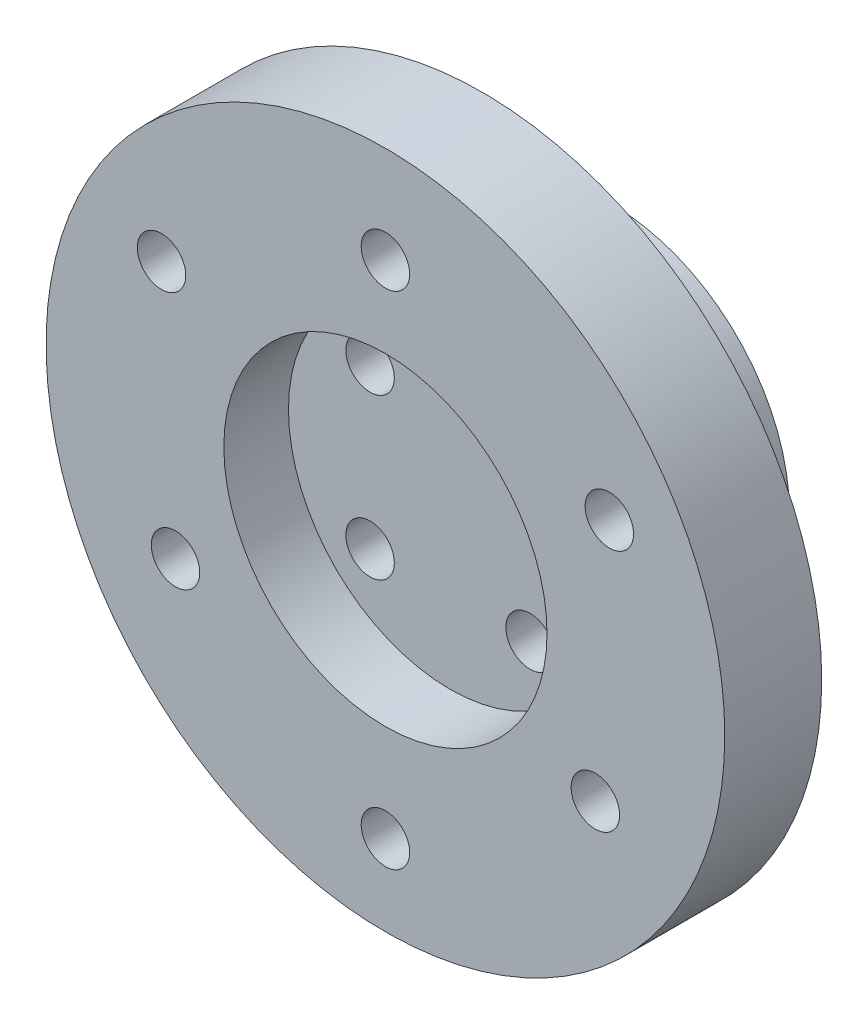
ISO-10303-21;
HEADER;
FILE_DESCRIPTION(('STEP AP214'),'2;1');
FILE_NAME('part.step','',(''),(''),'','','');
FILE_SCHEMA(('AUTOMOTIVE_DESIGN { 1 0 10303 214 1 1 1 1 }'));
ENDSEC;
DATA;
#1=APPLICATION_CONTEXT('core data for automotive mechanical design processes');
#2=APPLICATION_PROTOCOL_DEFINITION('international standard','automotive_design',2000,#1);
#3=PRODUCT_CONTEXT('',#1,'mechanical');
#4=PRODUCT('Part','Part','',(#3));
#5=PRODUCT_RELATED_PRODUCT_CATEGORY('part','',(#4));
#6=PRODUCT_DEFINITION_FORMATION('','',#4);
#7=PRODUCT_DEFINITION_CONTEXT('part definition',#1,'design');
#8=PRODUCT_DEFINITION('design','',#6,#7);
#9=PRODUCT_DEFINITION_SHAPE('','',#8);
#10=(LENGTH_UNIT() NAMED_UNIT(*) SI_UNIT(.MILLI.,.METRE.));
#11=(NAMED_UNIT(*) PLANE_ANGLE_UNIT() SI_UNIT($,.RADIAN.));
#12=(NAMED_UNIT(*) SI_UNIT($,.STERADIAN.) SOLID_ANGLE_UNIT());
#13=UNCERTAINTY_MEASURE_WITH_UNIT(LENGTH_MEASURE(1.E-05),#10,'distance_accuracy_value','');
#14=(GEOMETRIC_REPRESENTATION_CONTEXT(3) GLOBAL_UNCERTAINTY_ASSIGNED_CONTEXT((#13)) GLOBAL_UNIT_ASSIGNED_CONTEXT((#10,
#11,#12)) REPRESENTATION_CONTEXT('',''));
#15=CARTESIAN_POINT('',(0.,0.,0.));
#16=DIRECTION('',(0.,0.,1.));
#17=DIRECTION('',(1.,0.,0.));
#18=AXIS2_PLACEMENT_3D('',#15,#16,#17);
#19=CARTESIAN_POINT('',(-13.856406460551,7.99999999999997,6.));
#20=DIRECTION('',(0.,0.,-1.));
#21=DIRECTION('',(-1.,0.,0.));
#22=AXIS2_PLACEMENT_3D('',#19,#20,#21);
#23=CYLINDRICAL_SURFACE('',#22,1.5);
#24=CARTESIAN_POINT('',(-13.856406460551,7.99999999999997,6.));
#25=DIRECTION('',(0.,0.,-1.));
#26=DIRECTION('',(-1.,0.,0.));
#27=AXIS2_PLACEMENT_3D('',#24,#25,#26);
#28=CIRCLE('',#27,1.5);
#29=CARTESIAN_POINT('',(-15.356406460551,7.99999999999997,6.));
#30=VERTEX_POINT('',#29);
#31=EDGE_CURVE('E106',#30,#30,#28,.T.);
#32=ORIENTED_EDGE('',*,*,#31,.F.);
#33=EDGE_LOOP('',(#32));
#34=FACE_BOUND('',#33,.T.);
#35=CARTESIAN_POINT('',(-13.856406460551,7.99999999999997,2.5));
#36=DIRECTION('',(0.,0.,-1.));
#37=DIRECTION('',(-1.,0.,0.));
#38=AXIS2_PLACEMENT_3D('',#35,#36,#37);
#39=CIRCLE('',#38,1.5);
#40=CARTESIAN_POINT('',(-15.356406460551,7.99999999999997,2.5));
#41=VERTEX_POINT('',#40);
#42=EDGE_CURVE('E39',#41,#41,#39,.F.);
#43=ORIENTED_EDGE('',*,*,#42,.F.);
#44=EDGE_LOOP('',(#43));
#45=FACE_BOUND('',#44,.T.);
#46=ADVANCED_FACE('F35',(#34,#45),#23,.F.);
#47=CARTESIAN_POINT('',(-6.29051784696455E-13,-16.0000000000004,6.));
#48=DIRECTION('',(0.,0.,-1.));
#49=DIRECTION('',(-1.,0.,0.));
#50=AXIS2_PLACEMENT_3D('',#47,#48,#49);
#51=CYLINDRICAL_SURFACE('',#50,1.49999999999979);
#52=CARTESIAN_POINT('',(-6.29051784696455E-13,-16.0000000000004,6.));
#53=DIRECTION('',(0.,0.,-1.));
#54=DIRECTION('',(-1.,0.,0.));
#55=AXIS2_PLACEMENT_3D('',#52,#53,#54);
#56=CIRCLE('',#55,1.49999999999979);
#57=CARTESIAN_POINT('',(-1.50000000000041,-16.0000000000004,6.));
#58=VERTEX_POINT('',#57);
#59=EDGE_CURVE('E109',#58,#58,#56,.T.);
#60=ORIENTED_EDGE('',*,*,#59,.F.);
#61=EDGE_LOOP('',(#60));
#62=FACE_BOUND('',#61,.T.);
#63=CARTESIAN_POINT('',(-6.29051784696455E-13,-16.0000000000004,2.5));
#64=DIRECTION('',(0.,0.,-1.));
#65=DIRECTION('',(-1.,0.,0.));
#66=AXIS2_PLACEMENT_3D('',#63,#64,#65);
#67=CIRCLE('',#66,1.49999999999979);
#68=CARTESIAN_POINT('',(-1.50000000000041,-16.0000000000004,2.5));
#69=VERTEX_POINT('',#68);
#70=EDGE_CURVE('E73',#69,#69,#67,.F.);
#71=ORIENTED_EDGE('',*,*,#70,.F.);
#72=EDGE_LOOP('',(#71));
#73=FACE_BOUND('',#72,.T.);
#74=ADVANCED_FACE('F130',(#62,#73),#51,.F.);
#75=CARTESIAN_POINT('',(13.856406460551,7.99999999999926,6.));
#76=DIRECTION('',(0.,0.,-1.));
#77=DIRECTION('',(-1.,0.,0.));
#78=AXIS2_PLACEMENT_3D('',#75,#76,#77);
#79=CYLINDRICAL_SURFACE('',#78,1.50000000000054);
#80=CARTESIAN_POINT('',(13.856406460551,7.99999999999926,6.));
#81=DIRECTION('',(0.,0.,-1.));
#82=DIRECTION('',(-1.,0.,0.));
#83=AXIS2_PLACEMENT_3D('',#80,#81,#82);
#84=CIRCLE('',#83,1.50000000000054);
#85=CARTESIAN_POINT('',(12.3564064605505,7.99999999999926,6.));
#86=VERTEX_POINT('',#85);
#87=EDGE_CURVE('E99',#86,#86,#84,.T.);
#88=ORIENTED_EDGE('',*,*,#87,.F.);
#89=EDGE_LOOP('',(#88));
#90=FACE_BOUND('',#89,.T.);
#91=CARTESIAN_POINT('',(13.856406460551,7.99999999999926,2.5));
#92=DIRECTION('',(0.,0.,-1.));
#93=DIRECTION('',(-1.,0.,0.));
#94=AXIS2_PLACEMENT_3D('',#91,#92,#93);
#95=CIRCLE('',#94,1.50000000000054);
#96=CARTESIAN_POINT('',(12.3564064605505,7.99999999999926,2.5));
#97=VERTEX_POINT('',#96);
#98=EDGE_CURVE('E71',#97,#97,#95,.F.);
#99=ORIENTED_EDGE('',*,*,#98,.F.);
#100=EDGE_LOOP('',(#99));
#101=FACE_BOUND('',#100,.T.);
#102=ADVANCED_FACE('F133',(#90,#101),#79,.F.);
#103=CARTESIAN_POINT('',(4.94974746830584,4.94974746830582,10.));
#104=DIRECTION('',(0.,0.,-1.));
#105=DIRECTION('',(-1.,0.,0.));
#106=AXIS2_PLACEMENT_3D('',#103,#104,#105);
#107=CYLINDRICAL_SURFACE('',#106,1.5);
#108=CARTESIAN_POINT('',(4.94974746830584,4.94974746830582,-8.));
#109=DIRECTION('',(0.,0.,-1.));
#110=DIRECTION('',(-1.,0.,0.));
#111=AXIS2_PLACEMENT_3D('',#108,#109,#110);
#112=CIRCLE('',#111,1.5);
#113=CARTESIAN_POINT('',(3.44974746830584,4.94974746830582,-8.));
#114=VERTEX_POINT('',#113);
#115=EDGE_CURVE('E52',#114,#114,#112,.T.);
#116=ORIENTED_EDGE('',*,*,#115,.T.);
#117=EDGE_LOOP('',(#116));
#118=FACE_BOUND('',#117,.T.);
#119=CARTESIAN_POINT('',(4.94974746830584,4.94974746830582,2.));
#120=DIRECTION('',(0.,0.,1.));
#121=DIRECTION('',(1.,0.,0.));
#122=AXIS2_PLACEMENT_3D('',#119,#120,#121);
#123=CIRCLE('',#122,1.5);
#124=CARTESIAN_POINT('',(6.44974746830584,4.94974746830582,2.));
#125=VERTEX_POINT('',#124);
#126=EDGE_CURVE('E56',#125,#125,#123,.F.);
#127=ORIENTED_EDGE('',*,*,#126,.F.);
#128=EDGE_LOOP('',(#127));
#129=FACE_BOUND('',#128,.T.);
#130=ADVANCED_FACE('F139',(#118,#129),#107,.F.);
#131=CARTESIAN_POINT('',(-4.94974746830584,4.94974746830582,10.));
#132=DIRECTION('',(0.,0.,-1.));
#133=DIRECTION('',(-1.,0.,0.));
#134=AXIS2_PLACEMENT_3D('',#131,#132,#133);
#135=CYLINDRICAL_SURFACE('',#134,1.5);
#136=CARTESIAN_POINT('',(-4.94974746830584,4.94974746830582,-8.));
#137=DIRECTION('',(0.,0.,-1.));
#138=DIRECTION('',(-1.,0.,0.));
#139=AXIS2_PLACEMENT_3D('',#136,#137,#138);
#140=CIRCLE('',#139,1.5);
#141=CARTESIAN_POINT('',(-6.44974746830584,4.94974746830582,-8.));
#142=VERTEX_POINT('',#141);
#143=EDGE_CURVE('E55',#142,#142,#140,.T.);
#144=ORIENTED_EDGE('',*,*,#143,.T.);
#145=EDGE_LOOP('',(#144));
#146=FACE_BOUND('',#145,.T.);
#147=CARTESIAN_POINT('',(-4.94974746830584,4.94974746830582,2.));
#148=DIRECTION('',(0.,0.,1.));
#149=DIRECTION('',(1.,0.,0.));
#150=AXIS2_PLACEMENT_3D('',#147,#148,#149);
#151=CIRCLE('',#150,1.5);
#152=CARTESIAN_POINT('',(-3.44974746830584,4.94974746830582,2.));
#153=VERTEX_POINT('',#152);
#154=EDGE_CURVE('E92',#153,#153,#151,.F.);
#155=ORIENTED_EDGE('',*,*,#154,.F.);
#156=EDGE_LOOP('',(#155));
#157=FACE_BOUND('',#156,.T.);
#158=ADVANCED_FACE('F194',(#146,#157),#135,.F.);
#159=CARTESIAN_POINT('',(-4.94974746830581,-4.94974746830586,10.));
#160=DIRECTION('',(0.,0.,-1.));
#161=DIRECTION('',(-1.,0.,0.));
#162=AXIS2_PLACEMENT_3D('',#159,#160,#161);
#163=CYLINDRICAL_SURFACE('',#162,1.5);
#164=CARTESIAN_POINT('',(-4.94974746830581,-4.94974746830586,-8.));
#165=DIRECTION('',(0.,0.,-1.));
#166=DIRECTION('',(-1.,0.,0.));
#167=AXIS2_PLACEMENT_3D('',#164,#165,#166);
#168=CIRCLE('',#167,1.5);
#169=CARTESIAN_POINT('',(-6.44974746830581,-4.94974746830586,-8.));
#170=VERTEX_POINT('',#169);
#171=EDGE_CURVE('E59',#170,#170,#168,.T.);
#172=ORIENTED_EDGE('',*,*,#171,.T.);
#173=EDGE_LOOP('',(#172));
#174=FACE_BOUND('',#173,.T.);
#175=CARTESIAN_POINT('',(-4.94974746830581,-4.94974746830586,2.));
#176=DIRECTION('',(0.,0.,1.));
#177=DIRECTION('',(1.,0.,0.));
#178=AXIS2_PLACEMENT_3D('',#175,#176,#177);
#179=CIRCLE('',#178,1.5);
#180=CARTESIAN_POINT('',(-3.44974746830581,-4.94974746830586,2.));
#181=VERTEX_POINT('',#180);
#182=EDGE_CURVE('E69',#181,#181,#179,.F.);
#183=ORIENTED_EDGE('',*,*,#182,.F.);
#184=EDGE_LOOP('',(#183));
#185=FACE_BOUND('',#184,.T.);
#186=ADVANCED_FACE('F186',(#174,#185),#163,.F.);
#187=CARTESIAN_POINT('',(4.94974746830588,-4.94974746830579,10.));
#188=DIRECTION('',(0.,0.,-1.));
#189=DIRECTION('',(-1.,0.,0.));
#190=AXIS2_PLACEMENT_3D('',#187,#188,#189);
#191=CYLINDRICAL_SURFACE('',#190,1.5);
#192=CARTESIAN_POINT('',(4.94974746830588,-4.94974746830579,-8.));
#193=DIRECTION('',(0.,0.,-1.));
#194=DIRECTION('',(-1.,0.,0.));
#195=AXIS2_PLACEMENT_3D('',#192,#193,#194);
#196=CIRCLE('',#195,1.5);
#197=CARTESIAN_POINT('',(3.44974746830588,-4.94974746830579,-8.));
#198=VERTEX_POINT('',#197);
#199=EDGE_CURVE('E62',#198,#198,#196,.T.);
#200=ORIENTED_EDGE('',*,*,#199,.T.);
#201=EDGE_LOOP('',(#200));
#202=FACE_BOUND('',#201,.T.);
#203=CARTESIAN_POINT('',(4.94974746830588,-4.94974746830579,2.));
#204=DIRECTION('',(0.,0.,1.));
#205=DIRECTION('',(1.,0.,0.));
#206=AXIS2_PLACEMENT_3D('',#203,#204,#205);
#207=CIRCLE('',#206,1.5);
#208=CARTESIAN_POINT('',(6.44974746830587,-4.94974746830579,2.));
#209=VERTEX_POINT('',#208);
#210=EDGE_CURVE('E66',#209,#209,#207,.F.);
#211=ORIENTED_EDGE('',*,*,#210,.F.);
#212=EDGE_LOOP('',(#211));
#213=FACE_BOUND('',#212,.T.);
#214=ADVANCED_FACE('F181',(#202,#213),#191,.F.);
#215=CARTESIAN_POINT('',(0.,0.,6.));
#216=DIRECTION('',(0.,0.,-1.));
#217=DIRECTION('',(-1.,0.,0.));
#218=AXIS2_PLACEMENT_3D('',#215,#216,#217);
#219=CYLINDRICAL_SURFACE('',#218,21.);
#220=CARTESIAN_POINT('',(0.,0.,6.));
#221=DIRECTION('',(0.,0.,1.));
#222=DIRECTION('',(1.,0.,0.));
#223=AXIS2_PLACEMENT_3D('',#220,#221,#222);
#224=CIRCLE('',#223,21.);
#225=CARTESIAN_POINT('',(21.,0.,6.));
#226=VERTEX_POINT('',#225);
#227=EDGE_CURVE('E43',#226,#226,#224,.T.);
#228=ORIENTED_EDGE('',*,*,#227,.F.);
#229=EDGE_LOOP('',(#228));
#230=FACE_BOUND('',#229,.T.);
#231=CARTESIAN_POINT('',(0.,0.,0.));
#232=DIRECTION('',(0.,0.,1.));
#233=DIRECTION('',(1.,0.,0.));
#234=AXIS2_PLACEMENT_3D('',#231,#232,#233);
#235=CIRCLE('',#234,21.);
#236=CARTESIAN_POINT('',(21.,0.,0.));
#237=VERTEX_POINT('',#236);
#238=EDGE_CURVE('E48',#237,#237,#235,.T.);
#239=ORIENTED_EDGE('',*,*,#238,.T.);
#240=EDGE_LOOP('',(#239));
#241=FACE_BOUND('',#240,.T.);
#242=ADVANCED_FACE('F37',(#230,#241),#219,.T.);
#243=CARTESIAN_POINT('',(0.,0.,6.));
#244=DIRECTION('',(0.,0.,1.));
#245=DIRECTION('',(1.,0.,0.));
#246=AXIS2_PLACEMENT_3D('',#243,#244,#245);
#247=PLANE('',#246);
#248=CARTESIAN_POINT('',(0.,0.,6.));
#249=DIRECTION('',(0.,0.,1.));
#250=DIRECTION('',(1.,0.,0.));
#251=AXIS2_PLACEMENT_3D('',#248,#249,#250);
#252=CIRCLE('',#251,10.);
#253=CARTESIAN_POINT('',(10.,0.,6.));
#254=VERTEX_POINT('',#253);
#255=EDGE_CURVE('E79',#254,#254,#252,.T.);
#256=ORIENTED_EDGE('',*,*,#255,.F.);
#257=EDGE_LOOP('',(#256));
#258=FACE_BOUND('',#257,.T.);
#259=CARTESIAN_POINT('',(0.,15.,6.));
#260=DIRECTION('',(0.,0.,-1.));
#261=DIRECTION('',(-1.,0.,0.));
#262=AXIS2_PLACEMENT_3D('',#259,#260,#261);
#263=CIRCLE('',#262,1.5);
#264=CARTESIAN_POINT('',(-1.5,15.,6.));
#265=VERTEX_POINT('',#264);
#266=EDGE_CURVE('E100',#265,#265,#263,.T.);
#267=ORIENTED_EDGE('',*,*,#266,.T.);
#268=EDGE_LOOP('',(#267));
#269=FACE_BOUND('',#268,.T.);
#270=ORIENTED_EDGE('',*,*,#87,.T.);
#271=EDGE_LOOP('',(#270));
#272=FACE_BOUND('',#271,.T.);
#273=ORIENTED_EDGE('',*,*,#59,.T.);
#274=EDGE_LOOP('',(#273));
#275=FACE_BOUND('',#274,.T.);
#276=CARTESIAN_POINT('',(12.9903810567656,-7.50000000000055,6.));
#277=DIRECTION('',(0.,0.,-1.));
#278=DIRECTION('',(-1.,0.,0.));
#279=AXIS2_PLACEMENT_3D('',#276,#277,#278);
#280=CIRCLE('',#279,1.5);
#281=CARTESIAN_POINT('',(11.4903810567656,-7.50000000000055,6.));
#282=VERTEX_POINT('',#281);
#283=EDGE_CURVE('E121',#282,#282,#280,.T.);
#284=ORIENTED_EDGE('',*,*,#283,.T.);
#285=EDGE_LOOP('',(#284));
#286=FACE_BOUND('',#285,.T.);
#287=CARTESIAN_POINT('',(-12.9903810567675,-7.49999999999945,6.));
#288=DIRECTION('',(0.,0.,-1.));
#289=DIRECTION('',(-1.,0.,0.));
#290=AXIS2_PLACEMENT_3D('',#287,#288,#289);
#291=CIRCLE('',#290,1.5);
#292=CARTESIAN_POINT('',(-14.4903810567675,-7.49999999999945,6.));
#293=VERTEX_POINT('',#292);
#294=EDGE_CURVE('E115',#293,#293,#291,.T.);
#295=ORIENTED_EDGE('',*,*,#294,.T.);
#296=EDGE_LOOP('',(#295));
#297=FACE_BOUND('',#296,.T.);
#298=ORIENTED_EDGE('',*,*,#31,.T.);
#299=EDGE_LOOP('',(#298));
#300=FACE_BOUND('',#299,.T.);
#301=ORIENTED_EDGE('',*,*,#227,.T.);
#302=EDGE_LOOP('',(#301));
#303=FACE_BOUND('',#302,.T.);
#304=ADVANCED_FACE('F127',(#258,#269,#272,#275,#286,#297,#300,#303),#247,.T.);
#305=CARTESIAN_POINT('',(0.,0.,0.));
#306=DIRECTION('',(0.,0.,1.));
#307=DIRECTION('',(1.,0.,0.));
#308=AXIS2_PLACEMENT_3D('',#305,#306,#307);
#309=PLANE('',#308);
#310=CARTESIAN_POINT('',(13.856406460551,7.99999999999926,0.));
#311=DIRECTION('',(0.,0.,-1.));
#312=DIRECTION('',(-1.,0.,0.));
#313=AXIS2_PLACEMENT_3D('',#310,#311,#312);
#314=CIRCLE('',#313,3.5);
#315=CARTESIAN_POINT('',(10.356406460551,7.99999999999926,0.));
#316=VERTEX_POINT('',#315);
#317=EDGE_CURVE('E161',#316,#316,#314,.T.);
#318=ORIENTED_EDGE('',*,*,#317,.F.);
#319=EDGE_LOOP('',(#318));
#320=FACE_BOUND('',#319,.T.);
#321=CARTESIAN_POINT('',(-13.8564064605504,8.00000000000115,0.));
#322=DIRECTION('',(0.,0.,-1.));
#323=DIRECTION('',(-1.,0.,0.));
#324=AXIS2_PLACEMENT_3D('',#321,#322,#323);
#325=CIRCLE('',#324,3.5);
#326=CARTESIAN_POINT('',(-17.3564064605504,8.00000000000115,0.));
#327=VERTEX_POINT('',#326);
#328=EDGE_CURVE('E165',#327,#327,#325,.T.);
#329=ORIENTED_EDGE('',*,*,#328,.F.);
#330=EDGE_LOOP('',(#329));
#331=FACE_BOUND('',#330,.T.);
#332=CARTESIAN_POINT('',(-1.3165871754241E-12,-15.9999999999992,0.));
#333=DIRECTION('',(0.,0.,-1.));
#334=DIRECTION('',(-1.,0.,0.));
#335=AXIS2_PLACEMENT_3D('',#332,#333,#334);
#336=CIRCLE('',#335,3.5);
#337=CARTESIAN_POINT('',(-3.50000000000132,-15.9999999999992,0.));
#338=VERTEX_POINT('',#337);
#339=EDGE_CURVE('E169',#338,#338,#336,.T.);
#340=ORIENTED_EDGE('',*,*,#339,.F.);
#341=EDGE_LOOP('',(#340));
#342=FACE_BOUND('',#341,.T.);
#343=CARTESIAN_POINT('',(0.,0.,0.));
#344=DIRECTION('',(0.,0.,1.));
#345=DIRECTION('',(1.,0.,0.));
#346=AXIS2_PLACEMENT_3D('',#343,#344,#345);
#347=CIRCLE('',#346,11.);
#348=CARTESIAN_POINT('',(11.,0.,0.));
#349=VERTEX_POINT('',#348);
#350=EDGE_CURVE('E10',#349,#349,#347,.F.);
#351=ORIENTED_EDGE('',*,*,#350,.F.);
#352=EDGE_LOOP('',(#351));
#353=FACE_BOUND('',#352,.T.);
#354=CARTESIAN_POINT('',(0.,15.,0.));
#355=DIRECTION('',(0.,0.,-1.));
#356=DIRECTION('',(-1.,0.,0.));
#357=AXIS2_PLACEMENT_3D('',#354,#355,#356);
#358=CIRCLE('',#357,1.5);
#359=CARTESIAN_POINT('',(-1.5,15.,0.));
#360=VERTEX_POINT('',#359);
#361=EDGE_CURVE('E103',#360,#360,#358,.T.);
#362=ORIENTED_EDGE('',*,*,#361,.F.);
#363=EDGE_LOOP('',(#362));
#364=FACE_BOUND('',#363,.T.);
#365=CARTESIAN_POINT('',(12.9903810567656,-7.50000000000055,0.));
#366=DIRECTION('',(0.,0.,-1.));
#367=DIRECTION('',(-1.,0.,0.));
#368=AXIS2_PLACEMENT_3D('',#365,#366,#367);
#369=CIRCLE('',#368,1.5);
#370=CARTESIAN_POINT('',(11.4903810567656,-7.50000000000055,0.));
#371=VERTEX_POINT('',#370);
#372=EDGE_CURVE('E118',#371,#371,#369,.T.);
#373=ORIENTED_EDGE('',*,*,#372,.F.);
#374=EDGE_LOOP('',(#373));
#375=FACE_BOUND('',#374,.T.);
#376=CARTESIAN_POINT('',(-12.9903810567675,-7.49999999999945,0.));
#377=DIRECTION('',(0.,0.,-1.));
#378=DIRECTION('',(-1.,0.,0.));
#379=AXIS2_PLACEMENT_3D('',#376,#377,#378);
#380=CIRCLE('',#379,1.5);
#381=CARTESIAN_POINT('',(-14.4903810567675,-7.49999999999945,0.));
#382=VERTEX_POINT('',#381);
#383=EDGE_CURVE('E112',#382,#382,#380,.T.);
#384=ORIENTED_EDGE('',*,*,#383,.F.);
#385=EDGE_LOOP('',(#384));
#386=FACE_BOUND('',#385,.T.);
#387=ORIENTED_EDGE('',*,*,#238,.F.);
#388=EDGE_LOOP('',(#387));
#389=FACE_BOUND('',#388,.T.);
#390=ADVANCED_FACE('F149',(#320,#331,#342,#353,#364,#375,#386,#389),#309,.F.);
#391=CARTESIAN_POINT('',(-12.9903810567675,-7.49999999999945,6.));
#392=DIRECTION('',(0.,0.,-1.));
#393=DIRECTION('',(-1.,0.,0.));
#394=AXIS2_PLACEMENT_3D('',#391,#392,#393);
#395=CYLINDRICAL_SURFACE('',#394,1.5);
#396=ORIENTED_EDGE('',*,*,#294,.F.);
#397=EDGE_LOOP('',(#396));
#398=FACE_BOUND('',#397,.T.);
#399=ORIENTED_EDGE('',*,*,#383,.T.);
#400=EDGE_LOOP('',(#399));
#401=FACE_BOUND('',#400,.T.);
#402=ADVANCED_FACE('F152',(#398,#401),#395,.F.);
#403=CARTESIAN_POINT('',(12.9903810567656,-7.50000000000055,6.));
#404=DIRECTION('',(0.,0.,-1.));
#405=DIRECTION('',(-1.,0.,0.));
#406=AXIS2_PLACEMENT_3D('',#403,#404,#405);
#407=CYLINDRICAL_SURFACE('',#406,1.5);
#408=ORIENTED_EDGE('',*,*,#283,.F.);
#409=EDGE_LOOP('',(#408));
#410=FACE_BOUND('',#409,.T.);
#411=ORIENTED_EDGE('',*,*,#372,.T.);
#412=EDGE_LOOP('',(#411));
#413=FACE_BOUND('',#412,.T.);
#414=ADVANCED_FACE('F146',(#410,#413),#407,.F.);
#415=CARTESIAN_POINT('',(0.,15.,6.));
#416=DIRECTION('',(0.,0.,-1.));
#417=DIRECTION('',(-1.,0.,0.));
#418=AXIS2_PLACEMENT_3D('',#415,#416,#417);
#419=CYLINDRICAL_SURFACE('',#418,1.5);
#420=ORIENTED_EDGE('',*,*,#266,.F.);
#421=EDGE_LOOP('',(#420));
#422=FACE_BOUND('',#421,.T.);
#423=ORIENTED_EDGE('',*,*,#361,.T.);
#424=EDGE_LOOP('',(#423));
#425=FACE_BOUND('',#424,.T.);
#426=ADVANCED_FACE('F211',(#422,#425),#419,.F.);
#427=CARTESIAN_POINT('',(0.,0.,-8.));
#428=DIRECTION('',(0.,0.,1.));
#429=DIRECTION('',(1.,0.,0.));
#430=AXIS2_PLACEMENT_3D('',#427,#428,#429);
#431=CYLINDRICAL_SURFACE('',#430,11.);
#432=CARTESIAN_POINT('',(0.,0.,-8.));
#433=DIRECTION('',(0.,0.,-1.));
#434=DIRECTION('',(-1.,0.,0.));
#435=AXIS2_PLACEMENT_3D('',#432,#433,#434);
#436=CIRCLE('',#435,11.);
#437=CARTESIAN_POINT('',(-11.,0.,-8.));
#438=VERTEX_POINT('',#437);
#439=EDGE_CURVE('E65',#438,#438,#436,.T.);
#440=ORIENTED_EDGE('',*,*,#439,.F.);
#441=EDGE_LOOP('',(#440));
#442=FACE_BOUND('',#441,.T.);
#443=ORIENTED_EDGE('',*,*,#350,.T.);
#444=EDGE_LOOP('',(#443));
#445=FACE_BOUND('',#444,.T.);
#446=ADVANCED_FACE('F207',(#442,#445),#431,.T.);
#447=CARTESIAN_POINT('',(0.,0.,-8.));
#448=DIRECTION('',(0.,0.,-1.));
#449=DIRECTION('',(-1.,0.,0.));
#450=AXIS2_PLACEMENT_3D('',#447,#448,#449);
#451=PLANE('',#450);
#452=ORIENTED_EDGE('',*,*,#199,.F.);
#453=EDGE_LOOP('',(#452));
#454=FACE_BOUND('',#453,.T.);
#455=ORIENTED_EDGE('',*,*,#171,.F.);
#456=EDGE_LOOP('',(#455));
#457=FACE_BOUND('',#456,.T.);
#458=ORIENTED_EDGE('',*,*,#143,.F.);
#459=EDGE_LOOP('',(#458));
#460=FACE_BOUND('',#459,.T.);
#461=ORIENTED_EDGE('',*,*,#115,.F.);
#462=EDGE_LOOP('',(#461));
#463=FACE_BOUND('',#462,.T.);
#464=ORIENTED_EDGE('',*,*,#439,.T.);
#465=EDGE_LOOP('',(#464));
#466=FACE_BOUND('',#465,.T.);
#467=ADVANCED_FACE('F203',(#454,#457,#460,#463,#466),#451,.T.);
#468=CARTESIAN_POINT('',(0.,0.,2.));
#469=DIRECTION('',(0.,0.,1.));
#470=DIRECTION('',(1.,0.,0.));
#471=AXIS2_PLACEMENT_3D('',#468,#469,#470);
#472=PLANE('',#471);
#473=CARTESIAN_POINT('',(0.,0.,2.));
#474=DIRECTION('',(0.,0.,1.));
#475=DIRECTION('',(1.,0.,0.));
#476=AXIS2_PLACEMENT_3D('',#473,#474,#475);
#477=CIRCLE('',#476,10.);
#478=CARTESIAN_POINT('',(10.,0.,2.));
#479=VERTEX_POINT('',#478);
#480=EDGE_CURVE('E70',#479,#479,#477,.T.);
#481=ORIENTED_EDGE('',*,*,#480,.T.);
#482=EDGE_LOOP('',(#481));
#483=FACE_BOUND('',#482,.T.);
#484=ORIENTED_EDGE('',*,*,#210,.T.);
#485=EDGE_LOOP('',(#484));
#486=FACE_BOUND('',#485,.T.);
#487=ORIENTED_EDGE('',*,*,#182,.T.);
#488=EDGE_LOOP('',(#487));
#489=FACE_BOUND('',#488,.T.);
#490=ORIENTED_EDGE('',*,*,#154,.T.);
#491=EDGE_LOOP('',(#490));
#492=FACE_BOUND('',#491,.T.);
#493=ORIENTED_EDGE('',*,*,#126,.T.);
#494=EDGE_LOOP('',(#493));
#495=FACE_BOUND('',#494,.T.);
#496=ADVANCED_FACE('F206',(#483,#486,#489,#492,#495),#472,.T.);
#497=CARTESIAN_POINT('',(0.,0.,2.));
#498=DIRECTION('',(0.,0.,1.));
#499=DIRECTION('',(1.,0.,0.));
#500=AXIS2_PLACEMENT_3D('',#497,#498,#499);
#501=CYLINDRICAL_SURFACE('',#500,10.);
#502=ORIENTED_EDGE('',*,*,#480,.F.);
#503=EDGE_LOOP('',(#502));
#504=FACE_BOUND('',#503,.T.);
#505=ORIENTED_EDGE('',*,*,#255,.T.);
#506=EDGE_LOOP('',(#505));
#507=FACE_BOUND('',#506,.T.);
#508=ADVANCED_FACE('F230',(#504,#507),#501,.F.);
#509=CARTESIAN_POINT('',(13.856406460551,7.99999999999926,2.5));
#510=DIRECTION('',(0.,0.,-1.));
#511=DIRECTION('',(-1.,0.,0.));
#512=AXIS2_PLACEMENT_3D('',#509,#510,#511);
#513=PLANE('',#512);
#514=CARTESIAN_POINT('',(13.856406460551,7.99999999999926,2.5));
#515=DIRECTION('',(0.,0.,-1.));
#516=DIRECTION('',(-1.,0.,0.));
#517=AXIS2_PLACEMENT_3D('',#514,#515,#516);
#518=CIRCLE('',#517,3.5);
#519=CARTESIAN_POINT('',(10.356406460551,7.99999999999926,2.5));
#520=VERTEX_POINT('',#519);
#521=EDGE_CURVE('E74',#520,#520,#518,.T.);
#522=ORIENTED_EDGE('',*,*,#521,.T.);
#523=EDGE_LOOP('',(#522));
#524=FACE_BOUND('',#523,.T.);
#525=ORIENTED_EDGE('',*,*,#98,.T.);
#526=EDGE_LOOP('',(#525));
#527=FACE_BOUND('',#526,.T.);
#528=ADVANCED_FACE('F227',(#524,#527),#513,.T.);
#529=CARTESIAN_POINT('',(13.856406460551,7.99999999999926,2.5));
#530=DIRECTION('',(0.,0.,-1.));
#531=DIRECTION('',(-1.,0.,0.));
#532=AXIS2_PLACEMENT_3D('',#529,#530,#531);
#533=CYLINDRICAL_SURFACE('',#532,3.5);
#534=ORIENTED_EDGE('',*,*,#521,.F.);
#535=EDGE_LOOP('',(#534));
#536=FACE_BOUND('',#535,.T.);
#537=ORIENTED_EDGE('',*,*,#317,.T.);
#538=EDGE_LOOP('',(#537));
#539=FACE_BOUND('',#538,.T.);
#540=ADVANCED_FACE('F229',(#536,#539),#533,.F.);
#541=CARTESIAN_POINT('',(-1.3165871754241E-12,-15.9999999999992,2.5));
#542=DIRECTION('',(0.,0.,-1.));
#543=DIRECTION('',(-1.,0.,0.));
#544=AXIS2_PLACEMENT_3D('',#541,#542,#543);
#545=PLANE('',#544);
#546=CARTESIAN_POINT('',(-1.3165871754241E-12,-15.9999999999992,2.5));
#547=DIRECTION('',(0.,0.,-1.));
#548=DIRECTION('',(-1.,0.,0.));
#549=AXIS2_PLACEMENT_3D('',#546,#547,#548);
#550=CIRCLE('',#549,3.5);
#551=CARTESIAN_POINT('',(-3.50000000000132,-15.9999999999992,2.5));
#552=VERTEX_POINT('',#551);
#553=EDGE_CURVE('E455',#552,#552,#550,.T.);
#554=ORIENTED_EDGE('',*,*,#553,.T.);
#555=EDGE_LOOP('',(#554));
#556=FACE_BOUND('',#555,.T.);
#557=ORIENTED_EDGE('',*,*,#70,.T.);
#558=EDGE_LOOP('',(#557));
#559=FACE_BOUND('',#558,.T.);
#560=ADVANCED_FACE('F237',(#556,#559),#545,.T.);
#561=CARTESIAN_POINT('',(-1.3165871754241E-12,-15.9999999999992,2.5));
#562=DIRECTION('',(0.,0.,-1.));
#563=DIRECTION('',(-1.,0.,0.));
#564=AXIS2_PLACEMENT_3D('',#561,#562,#563);
#565=CYLINDRICAL_SURFACE('',#564,3.5);
#566=ORIENTED_EDGE('',*,*,#553,.F.);
#567=EDGE_LOOP('',(#566));
#568=FACE_BOUND('',#567,.T.);
#569=ORIENTED_EDGE('',*,*,#339,.T.);
#570=EDGE_LOOP('',(#569));
#571=FACE_BOUND('',#570,.T.);
#572=ADVANCED_FACE('F251',(#568,#571),#565,.F.);
#573=CARTESIAN_POINT('',(-13.8564064605504,8.00000000000115,2.5));
#574=DIRECTION('',(0.,0.,-1.));
#575=DIRECTION('',(-1.,0.,0.));
#576=AXIS2_PLACEMENT_3D('',#573,#574,#575);
#577=PLANE('',#576);
#578=CARTESIAN_POINT('',(-13.8564064605504,8.00000000000115,2.5));
#579=DIRECTION('',(0.,0.,-1.));
#580=DIRECTION('',(-1.,0.,0.));
#581=AXIS2_PLACEMENT_3D('',#578,#579,#580);
#582=CIRCLE('',#581,3.5);
#583=CARTESIAN_POINT('',(-17.3564064605504,8.00000000000115,2.5));
#584=VERTEX_POINT('',#583);
#585=EDGE_CURVE('E456',#584,#584,#582,.T.);
#586=ORIENTED_EDGE('',*,*,#585,.T.);
#587=EDGE_LOOP('',(#586));
#588=FACE_BOUND('',#587,.T.);
#589=ORIENTED_EDGE('',*,*,#42,.T.);
#590=EDGE_LOOP('',(#589));
#591=FACE_BOUND('',#590,.T.);
#592=ADVANCED_FACE('F247',(#588,#591),#577,.T.);
#593=CARTESIAN_POINT('',(-13.8564064605504,8.00000000000115,2.5));
#594=DIRECTION('',(0.,0.,-1.));
#595=DIRECTION('',(-1.,0.,0.));
#596=AXIS2_PLACEMENT_3D('',#593,#594,#595);
#597=CYLINDRICAL_SURFACE('',#596,3.5);
#598=ORIENTED_EDGE('',*,*,#585,.F.);
#599=EDGE_LOOP('',(#598));
#600=FACE_BOUND('',#599,.T.);
#601=ORIENTED_EDGE('',*,*,#328,.T.);
#602=EDGE_LOOP('',(#601));
#603=FACE_BOUND('',#602,.T.);
#604=ADVANCED_FACE('F244',(#600,#603),#597,.F.);
#605=CLOSED_SHELL('',(#46,#74,#102,#130,#158,#186,#214,#242,#304,#390,#402,#414,#426,#446,#467,
#496,#508,#528,#540,#560,#572,#592,#604));
#606=MANIFOLD_SOLID_BREP('B2',#605);
#607=ADVANCED_BREP_SHAPE_REPRESENTATION('',(#18,#606),#14);
#608=SHAPE_DEFINITION_REPRESENTATION(#9,#607);
ENDSEC;
END-ISO-10303-21;
